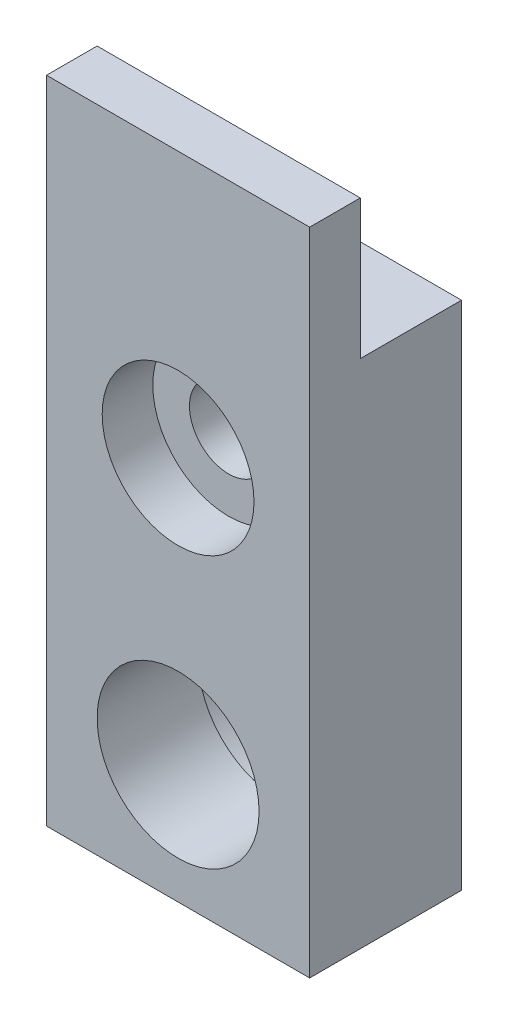
ISO-10303-21;
HEADER;
FILE_DESCRIPTION(('STEP AP214'),'2;1');
FILE_NAME('part.step','',(''),(''),'','','');
FILE_SCHEMA(('AUTOMOTIVE_DESIGN { 1 0 10303 214 1 1 1 1 }'));
ENDSEC;
DATA;
#1=APPLICATION_CONTEXT('core data for automotive mechanical design processes');
#2=APPLICATION_PROTOCOL_DEFINITION('international standard','automotive_design',2000,#1);
#3=PRODUCT_CONTEXT('',#1,'mechanical');
#4=PRODUCT('Part','Part','',(#3));
#5=PRODUCT_RELATED_PRODUCT_CATEGORY('part','',(#4));
#6=PRODUCT_DEFINITION_FORMATION('','',#4);
#7=PRODUCT_DEFINITION_CONTEXT('part definition',#1,'design');
#8=PRODUCT_DEFINITION('design','',#6,#7);
#9=PRODUCT_DEFINITION_SHAPE('','',#8);
#10=(LENGTH_UNIT() NAMED_UNIT(*) SI_UNIT(.MILLI.,.METRE.));
#11=(NAMED_UNIT(*) PLANE_ANGLE_UNIT() SI_UNIT($,.RADIAN.));
#12=(NAMED_UNIT(*) SI_UNIT($,.STERADIAN.) SOLID_ANGLE_UNIT());
#13=UNCERTAINTY_MEASURE_WITH_UNIT(LENGTH_MEASURE(1.E-05),#10,'distance_accuracy_value','');
#14=(GEOMETRIC_REPRESENTATION_CONTEXT(3) GLOBAL_UNCERTAINTY_ASSIGNED_CONTEXT((#13)) GLOBAL_UNIT_ASSIGNED_CONTEXT((#10,
#11,#12)) REPRESENTATION_CONTEXT('',''));
#15=CARTESIAN_POINT('',(0.,0.,0.));
#16=DIRECTION('',(0.,0.,1.));
#17=DIRECTION('',(1.,0.,0.));
#18=AXIS2_PLACEMENT_3D('',#15,#16,#17);
#19=CARTESIAN_POINT('',(-15.3152194114667,4.78461651859422,15.));
#20=DIRECTION('',(0.,1.,0.));
#21=DIRECTION('',(0.,0.,1.));
#22=AXIS2_PLACEMENT_3D('',#19,#20,#21);
#23=PLANE('',#22);
#24=DIRECTION('',(-1.,0.,0.));
#25=VECTOR('',#24,1.);
#26=CARTESIAN_POINT('',(-0.51521941146666,4.78461651859422,14.));
#27=LINE('',#26,#25);
#28=CARTESIAN_POINT('',(-5.11521941146666,4.78461651859422,14.));
#29=VERTEX_POINT('',#28);
#30=CARTESIAN_POINT('',(-15.5152194114667,4.78461651859422,14.));
#31=VERTEX_POINT('',#30);
#32=EDGE_CURVE('E146',#29,#31,#27,.T.);
#33=ORIENTED_EDGE('',*,*,#32,.F.);
#34=DIRECTION('',(0.,0.,1.));
#35=VECTOR('',#34,1.);
#36=CARTESIAN_POINT('',(-5.11521941146666,4.78461651859422,8.));
#37=LINE('',#36,#35);
#38=CARTESIAN_POINT('',(-5.11521941146666,4.78461651859422,12.));
#39=VERTEX_POINT('',#38);
#40=EDGE_CURVE('E175',#39,#29,#37,.T.);
#41=ORIENTED_EDGE('',*,*,#40,.F.);
#42=DIRECTION('',(1.,0.,0.));
#43=VECTOR('',#42,1.);
#44=CARTESIAN_POINT('',(-20.3152194114667,4.78461651859422,12.));
#45=LINE('',#44,#43);
#46=CARTESIAN_POINT('',(-15.5152194114667,4.78461651859422,12.));
#47=VERTEX_POINT('',#46);
#48=EDGE_CURVE('E168',#47,#39,#45,.T.);
#49=ORIENTED_EDGE('',*,*,#48,.F.);
#50=DIRECTION('',(0.,0.,1.));
#51=VECTOR('',#50,1.);
#52=CARTESIAN_POINT('',(-15.5152194114667,4.78461651859422,8.));
#53=LINE('',#52,#51);
#54=EDGE_CURVE('E162',#47,#31,#53,.T.);
#55=ORIENTED_EDGE('',*,*,#54,.T.);
#56=EDGE_LOOP('',(#33,#41,#49,#55));
#57=FACE_BOUND('',#56,.T.);
#58=ADVANCED_FACE('F95',(#57),#23,.T.);
#59=CARTESIAN_POINT('',(-20.3152194114667,-20.7153834814058,8.));
#60=DIRECTION('',(0.,0.,1.));
#61=DIRECTION('',(1.,0.,0.));
#62=AXIS2_PLACEMENT_3D('',#59,#60,#61);
#63=PLANE('',#62);
#64=CARTESIAN_POINT('',(-10.3152194114667,-5.71538348140578,8.));
#65=DIRECTION('',(0.,0.,1.));
#66=DIRECTION('',(1.,0.,0.));
#67=AXIS2_PLACEMENT_3D('',#64,#65,#66);
#68=CIRCLE('',#67,1.55);
#69=CARTESIAN_POINT('',(-8.76521941146666,-5.71538348140578,8.));
#70=VERTEX_POINT('',#69);
#71=EDGE_CURVE('E202',#70,#70,#68,.F.);
#72=ORIENTED_EDGE('',*,*,#71,.F.);
#73=EDGE_LOOP('',(#72));
#74=FACE_BOUND('',#73,.T.);
#75=CARTESIAN_POINT('',(-10.3152194114667,-16.2153834814058,8.));
#76=DIRECTION('',(0.,0.,-1.));
#77=DIRECTION('',(-1.,0.,0.));
#78=AXIS2_PLACEMENT_3D('',#75,#76,#77);
#79=CIRCLE('',#78,4.);
#80=CARTESIAN_POINT('',(-14.3152194114667,-16.2153834814058,8.));
#81=VERTEX_POINT('',#80);
#82=EDGE_CURVE('E196',#81,#81,#79,.T.);
#83=ORIENTED_EDGE('',*,*,#82,.F.);
#84=EDGE_LOOP('',(#83));
#85=FACE_BOUND('',#84,.T.);
#86=DIRECTION('',(0.,-1.,0.));
#87=VECTOR('',#86,1.);
#88=CARTESIAN_POINT('',(-15.5152194114667,0.,8.));
#89=LINE('',#88,#87);
#90=CARTESIAN_POINT('',(-15.5152194114667,-0.715383481405782,8.));
#91=VERTEX_POINT('',#90);
#92=CARTESIAN_POINT('',(-15.5152194114667,-20.9153834814058,8.));
#93=VERTEX_POINT('',#92);
#94=EDGE_CURVE('E170',#91,#93,#89,.T.);
#95=ORIENTED_EDGE('',*,*,#94,.F.);
#96=DIRECTION('',(-1.,0.,0.));
#97=VECTOR('',#96,1.);
#98=CARTESIAN_POINT('',(-20.3152194114667,-0.715383481405783,8.));
#99=LINE('',#98,#97);
#100=CARTESIAN_POINT('',(-5.11521941146666,-0.71538348140578,8.));
#101=VERTEX_POINT('',#100);
#102=EDGE_CURVE('E103',#101,#91,#99,.T.);
#103=ORIENTED_EDGE('',*,*,#102,.F.);
#104=DIRECTION('',(0.,-1.,0.));
#105=VECTOR('',#104,1.);
#106=CARTESIAN_POINT('',(-5.11521941146666,0.,8.));
#107=LINE('',#106,#105);
#108=CARTESIAN_POINT('',(-5.11521941146666,-20.9153834814058,8.));
#109=VERTEX_POINT('',#108);
#110=EDGE_CURVE('E179',#101,#109,#107,.T.);
#111=ORIENTED_EDGE('',*,*,#110,.T.);
#112=DIRECTION('',(1.,0.,0.));
#113=VECTOR('',#112,1.);
#114=CARTESIAN_POINT('',(-15.5152194114667,-20.9153834814058,8.));
#115=LINE('',#114,#113);
#116=EDGE_CURVE('E184',#93,#109,#115,.T.);
#117=ORIENTED_EDGE('',*,*,#116,.F.);
#118=EDGE_LOOP('',(#95,#103,#111,#117));
#119=FACE_BOUND('',#118,.T.);
#120=ADVANCED_FACE('F231',(#74,#85,#119),#63,.F.);
#121=CARTESIAN_POINT('',(-10.3152194114667,-5.71538348140578,0.));
#122=DIRECTION('',(0.,0.,1.));
#123=DIRECTION('',(1.,0.,0.));
#124=AXIS2_PLACEMENT_3D('',#121,#122,#123);
#125=CYLINDRICAL_SURFACE('',#124,1.55);
#126=ORIENTED_EDGE('',*,*,#71,.T.);
#127=EDGE_LOOP('',(#126));
#128=FACE_BOUND('',#127,.T.);
#129=CARTESIAN_POINT('',(-10.3152194114667,-5.71538348140578,12.));
#130=DIRECTION('',(0.,0.,1.));
#131=DIRECTION('',(1.,0.,0.));
#132=AXIS2_PLACEMENT_3D('',#129,#130,#131);
#133=CIRCLE('',#132,1.55);
#134=CARTESIAN_POINT('',(-8.76521941146666,-5.71538348140578,12.));
#135=VERTEX_POINT('',#134);
#136=EDGE_CURVE('E213',#135,#135,#133,.F.);
#137=ORIENTED_EDGE('',*,*,#136,.F.);
#138=EDGE_LOOP('',(#137));
#139=FACE_BOUND('',#138,.T.);
#140=ADVANCED_FACE('F266',(#128,#139),#125,.F.);
#141=CARTESIAN_POINT('',(-10.3152194114667,-5.71538348140578,12.));
#142=DIRECTION('',(0.,0.,1.));
#143=DIRECTION('',(1.,0.,0.));
#144=AXIS2_PLACEMENT_3D('',#141,#142,#143);
#145=PLANE('',#144);
#146=CARTESIAN_POINT('',(-10.3152194114667,-5.71538348140578,12.));
#147=DIRECTION('',(0.,0.,1.));
#148=DIRECTION('',(1.,0.,0.));
#149=AXIS2_PLACEMENT_3D('',#146,#147,#148);
#150=CIRCLE('',#149,3.);
#151=CARTESIAN_POINT('',(-7.31521941146666,-5.71538348140578,12.));
#152=VERTEX_POINT('',#151);
#153=EDGE_CURVE('E209',#152,#152,#150,.T.);
#154=ORIENTED_EDGE('',*,*,#153,.T.);
#155=EDGE_LOOP('',(#154));
#156=FACE_BOUND('',#155,.T.);
#157=ORIENTED_EDGE('',*,*,#136,.T.);
#158=EDGE_LOOP('',(#157));
#159=FACE_BOUND('',#158,.T.);
#160=ADVANCED_FACE('F272',(#156,#159),#145,.T.);
#161=CARTESIAN_POINT('',(-10.3152194114667,-5.71538348140578,12.));
#162=DIRECTION('',(0.,0.,1.));
#163=DIRECTION('',(1.,0.,0.));
#164=AXIS2_PLACEMENT_3D('',#161,#162,#163);
#165=CYLINDRICAL_SURFACE('',#164,3.);
#166=CARTESIAN_POINT('',(-10.3152194114667,-5.71538348140578,14.));
#167=DIRECTION('',(0.,0.,-1.));
#168=DIRECTION('',(0.,1.,0.));
#169=AXIS2_PLACEMENT_3D('',#166,#167,#168);
#170=CIRCLE('',#169,3.);
#171=CARTESIAN_POINT('',(-10.3152194114667,-2.71538348140578,14.));
#172=VERTEX_POINT('',#171);
#173=EDGE_CURVE('E228',#172,#172,#170,.F.);
#174=ORIENTED_EDGE('',*,*,#173,.T.);
#175=EDGE_LOOP('',(#174));
#176=FACE_BOUND('',#175,.T.);
#177=ORIENTED_EDGE('',*,*,#153,.F.);
#178=EDGE_LOOP('',(#177));
#179=FACE_BOUND('',#178,.T.);
#180=ADVANCED_FACE('F279',(#176,#179),#165,.F.);
#181=CARTESIAN_POINT('',(-10.3152194114667,-16.2153834814058,10.));
#182=DIRECTION('',(0.,0.,-1.));
#183=DIRECTION('',(-1.,0.,0.));
#184=AXIS2_PLACEMENT_3D('',#181,#182,#183);
#185=PLANE('',#184);
#186=CARTESIAN_POINT('',(-10.3152194114667,-16.2153834814058,10.));
#187=DIRECTION('',(0.,0.,-1.));
#188=DIRECTION('',(-1.,0.,0.));
#189=AXIS2_PLACEMENT_3D('',#186,#187,#188);
#190=CIRCLE('',#189,4.);
#191=CARTESIAN_POINT('',(-14.3152194114667,-16.2153834814058,10.));
#192=VERTEX_POINT('',#191);
#193=EDGE_CURVE('E198',#192,#192,#190,.T.);
#194=ORIENTED_EDGE('',*,*,#193,.T.);
#195=EDGE_LOOP('',(#194));
#196=FACE_BOUND('',#195,.T.);
#197=CARTESIAN_POINT('',(-10.3152194114667,-16.2153834814058,10.));
#198=DIRECTION('',(0.,0.,1.));
#199=DIRECTION('',(1.,0.,0.));
#200=AXIS2_PLACEMENT_3D('',#197,#198,#199);
#201=CIRCLE('',#200,3.2);
#202=CARTESIAN_POINT('',(-7.11521941146666,-16.2153834814058,10.));
#203=VERTEX_POINT('',#202);
#204=EDGE_CURVE('E166',#203,#203,#201,.T.);
#205=ORIENTED_EDGE('',*,*,#204,.T.);
#206=EDGE_LOOP('',(#205));
#207=FACE_BOUND('',#206,.T.);
#208=ADVANCED_FACE('F258',(#196,#207),#185,.T.);
#209=CARTESIAN_POINT('',(-10.3152194114667,-16.2153834814058,10.));
#210=DIRECTION('',(0.,0.,-1.));
#211=DIRECTION('',(-1.,0.,0.));
#212=AXIS2_PLACEMENT_3D('',#209,#210,#211);
#213=CYLINDRICAL_SURFACE('',#212,4.);
#214=ORIENTED_EDGE('',*,*,#193,.F.);
#215=EDGE_LOOP('',(#214));
#216=FACE_BOUND('',#215,.T.);
#217=ORIENTED_EDGE('',*,*,#82,.T.);
#218=EDGE_LOOP('',(#217));
#219=FACE_BOUND('',#218,.T.);
#220=ADVANCED_FACE('F251',(#216,#219),#213,.F.);
#221=CARTESIAN_POINT('',(-20.3152194114667,0.,12.));
#222=DIRECTION('',(0.,0.,-1.));
#223=DIRECTION('',(-1.,0.,0.));
#224=AXIS2_PLACEMENT_3D('',#221,#222,#223);
#225=PLANE('',#224);
#226=DIRECTION('',(1.,0.,0.));
#227=VECTOR('',#226,1.);
#228=CARTESIAN_POINT('',(-20.3152194114667,-0.715383481405783,12.));
#229=LINE('',#228,#227);
#230=CARTESIAN_POINT('',(-15.5152194114667,-0.715383481405782,12.));
#231=VERTEX_POINT('',#230);
#232=CARTESIAN_POINT('',(-5.11521941146666,-0.71538348140578,12.));
#233=VERTEX_POINT('',#232);
#234=EDGE_CURVE('E117',#231,#233,#229,.T.);
#235=ORIENTED_EDGE('',*,*,#234,.F.);
#236=DIRECTION('',(0.,-1.,0.));
#237=VECTOR('',#236,1.);
#238=CARTESIAN_POINT('',(-15.5152194114667,4.78461651859422,12.));
#239=LINE('',#238,#237);
#240=EDGE_CURVE('E226',#47,#231,#239,.T.);
#241=ORIENTED_EDGE('',*,*,#240,.F.);
#242=ORIENTED_EDGE('',*,*,#48,.T.);
#243=DIRECTION('',(0.,-1.,0.));
#244=VECTOR('',#243,1.);
#245=CARTESIAN_POINT('',(-5.11521941146666,0.,12.));
#246=LINE('',#245,#244);
#247=EDGE_CURVE('E246',#39,#233,#246,.T.);
#248=ORIENTED_EDGE('',*,*,#247,.T.);
#249=EDGE_LOOP('',(#235,#241,#242,#248));
#250=FACE_BOUND('',#249,.T.);
#251=ADVANCED_FACE('F249',(#250),#225,.T.);
#252=CARTESIAN_POINT('',(-20.3152194114667,-0.715383481405783,0.));
#253=DIRECTION('',(0.,1.,0.));
#254=DIRECTION('',(-1.,0.,0.));
#255=AXIS2_PLACEMENT_3D('',#252,#253,#254);
#256=PLANE('',#255);
#257=ORIENTED_EDGE('',*,*,#102,.T.);
#258=DIRECTION('',(0.,0.,1.));
#259=VECTOR('',#258,1.);
#260=CARTESIAN_POINT('',(-15.5152194114667,-0.715383481405782,8.));
#261=LINE('',#260,#259);
#262=EDGE_CURVE('E221',#91,#231,#261,.T.);
#263=ORIENTED_EDGE('',*,*,#262,.T.);
#264=ORIENTED_EDGE('',*,*,#234,.T.);
#265=DIRECTION('',(0.,0.,1.));
#266=VECTOR('',#265,1.);
#267=CARTESIAN_POINT('',(-5.11521941146666,-0.71538348140578,8.));
#268=LINE('',#267,#266);
#269=EDGE_CURVE('E189',#101,#233,#268,.T.);
#270=ORIENTED_EDGE('',*,*,#269,.F.);
#271=EDGE_LOOP('',(#257,#263,#264,#270));
#272=FACE_BOUND('',#271,.T.);
#273=ADVANCED_FACE('F220',(#272),#256,.T.);
#274=CARTESIAN_POINT('',(-15.5152194114667,0.,8.));
#275=DIRECTION('',(-1.,0.,0.));
#276=DIRECTION('',(0.,-1.,0.));
#277=AXIS2_PLACEMENT_3D('',#274,#275,#276);
#278=PLANE('',#277);
#279=DIRECTION('',(0.,-1.,0.));
#280=VECTOR('',#279,1.);
#281=CARTESIAN_POINT('',(-15.5152194114667,4.78461651859422,14.));
#282=LINE('',#281,#280);
#283=CARTESIAN_POINT('',(-15.5152194114667,-20.9153834814058,14.));
#284=VERTEX_POINT('',#283);
#285=EDGE_CURVE('E109',#31,#284,#282,.T.);
#286=ORIENTED_EDGE('',*,*,#285,.F.);
#287=ORIENTED_EDGE('',*,*,#54,.F.);
#288=ORIENTED_EDGE('',*,*,#240,.T.);
#289=ORIENTED_EDGE('',*,*,#262,.F.);
#290=ORIENTED_EDGE('',*,*,#94,.T.);
#291=DIRECTION('',(0.,0.,1.));
#292=VECTOR('',#291,1.);
#293=CARTESIAN_POINT('',(-15.5152194114667,-20.9153834814058,8.));
#294=LINE('',#293,#292);
#295=EDGE_CURVE('E164',#93,#284,#294,.T.);
#296=ORIENTED_EDGE('',*,*,#295,.T.);
#297=EDGE_LOOP('',(#286,#287,#288,#289,#290,#296));
#298=FACE_BOUND('',#297,.T.);
#299=ADVANCED_FACE('F160',(#298),#278,.T.);
#300=CARTESIAN_POINT('',(-5.11521941146666,0.,8.));
#301=DIRECTION('',(-1.,0.,0.));
#302=DIRECTION('',(0.,-1.,0.));
#303=AXIS2_PLACEMENT_3D('',#300,#301,#302);
#304=PLANE('',#303);
#305=ORIENTED_EDGE('',*,*,#40,.T.);
#306=DIRECTION('',(0.,-1.,0.));
#307=VECTOR('',#306,1.);
#308=CARTESIAN_POINT('',(-5.11521941146666,0.,14.));
#309=LINE('',#308,#307);
#310=CARTESIAN_POINT('',(-5.11521941146666,-20.9153834814058,14.));
#311=VERTEX_POINT('',#310);
#312=EDGE_CURVE('E150',#29,#311,#309,.T.);
#313=ORIENTED_EDGE('',*,*,#312,.T.);
#314=DIRECTION('',(0.,0.,1.));
#315=VECTOR('',#314,1.);
#316=CARTESIAN_POINT('',(-5.11521941146666,-20.9153834814058,8.));
#317=LINE('',#316,#315);
#318=EDGE_CURVE('E188',#109,#311,#317,.T.);
#319=ORIENTED_EDGE('',*,*,#318,.F.);
#320=ORIENTED_EDGE('',*,*,#110,.F.);
#321=ORIENTED_EDGE('',*,*,#269,.T.);
#322=ORIENTED_EDGE('',*,*,#247,.F.);
#323=EDGE_LOOP('',(#305,#313,#319,#320,#321,#322));
#324=FACE_BOUND('',#323,.T.);
#325=ADVANCED_FACE('F236',(#324),#304,.F.);
#326=CARTESIAN_POINT('',(-15.5152194114667,-20.9153834814058,8.));
#327=DIRECTION('',(0.,-1.,0.));
#328=DIRECTION('',(0.,0.,-1.));
#329=AXIS2_PLACEMENT_3D('',#326,#327,#328);
#330=PLANE('',#329);
#331=DIRECTION('',(1.,0.,0.));
#332=VECTOR('',#331,1.);
#333=CARTESIAN_POINT('',(-15.5152194114667,-20.9153834814058,14.));
#334=LINE('',#333,#332);
#335=EDGE_CURVE('E12',#284,#311,#334,.T.);
#336=ORIENTED_EDGE('',*,*,#335,.F.);
#337=ORIENTED_EDGE('',*,*,#295,.F.);
#338=ORIENTED_EDGE('',*,*,#116,.T.);
#339=ORIENTED_EDGE('',*,*,#318,.T.);
#340=EDGE_LOOP('',(#336,#337,#338,#339));
#341=FACE_BOUND('',#340,.T.);
#342=ADVANCED_FACE('F234',(#341),#330,.T.);
#343=CARTESIAN_POINT('',(-0.51521941146666,4.78461651859422,14.));
#344=DIRECTION('',(0.,0.,-1.));
#345=DIRECTION('',(0.,1.,0.));
#346=AXIS2_PLACEMENT_3D('',#343,#344,#345);
#347=PLANE('',#346);
#348=ORIENTED_EDGE('',*,*,#173,.F.);
#349=EDGE_LOOP('',(#348));
#350=FACE_BOUND('',#349,.T.);
#351=ORIENTED_EDGE('',*,*,#32,.T.);
#352=ORIENTED_EDGE('',*,*,#285,.T.);
#353=ORIENTED_EDGE('',*,*,#335,.T.);
#354=ORIENTED_EDGE('',*,*,#312,.F.);
#355=EDGE_LOOP('',(#351,#352,#353,#354));
#356=FACE_BOUND('',#355,.T.);
#357=CARTESIAN_POINT('',(-10.3152194114667,-16.2153834814058,14.));
#358=DIRECTION('',(0.,0.,1.));
#359=DIRECTION('',(1.,0.,0.));
#360=AXIS2_PLACEMENT_3D('',#357,#358,#359);
#361=CIRCLE('',#360,3.2);
#362=CARTESIAN_POINT('',(-7.11521941146666,-16.2153834814058,14.));
#363=VERTEX_POINT('',#362);
#364=EDGE_CURVE('E420',#363,#363,#361,.T.);
#365=ORIENTED_EDGE('',*,*,#364,.F.);
#366=EDGE_LOOP('',(#365));
#367=FACE_BOUND('',#366,.T.);
#368=ADVANCED_FACE('F147',(#350,#356,#367),#347,.F.);
#369=CARTESIAN_POINT('',(-10.3152194114667,-16.2153834814058,10.));
#370=DIRECTION('',(0.,0.,1.));
#371=DIRECTION('',(1.,0.,0.));
#372=AXIS2_PLACEMENT_3D('',#369,#370,#371);
#373=CYLINDRICAL_SURFACE('',#372,3.2);
#374=ORIENTED_EDGE('',*,*,#204,.F.);
#375=EDGE_LOOP('',(#374));
#376=FACE_BOUND('',#375,.T.);
#377=ORIENTED_EDGE('',*,*,#364,.T.);
#378=EDGE_LOOP('',(#377));
#379=FACE_BOUND('',#378,.T.);
#380=ADVANCED_FACE('F295',(#376,#379),#373,.F.);
#381=CLOSED_SHELL('',(#58,#120,#140,#160,#180,#208,#220,#251,#273,#299,#325,#342,#368,#380));
#382=MANIFOLD_SOLID_BREP('B2',#381);
#383=ADVANCED_BREP_SHAPE_REPRESENTATION('',(#18,#382),#14);
#384=SHAPE_DEFINITION_REPRESENTATION(#9,#383);
ENDSEC;
END-ISO-10303-21;
